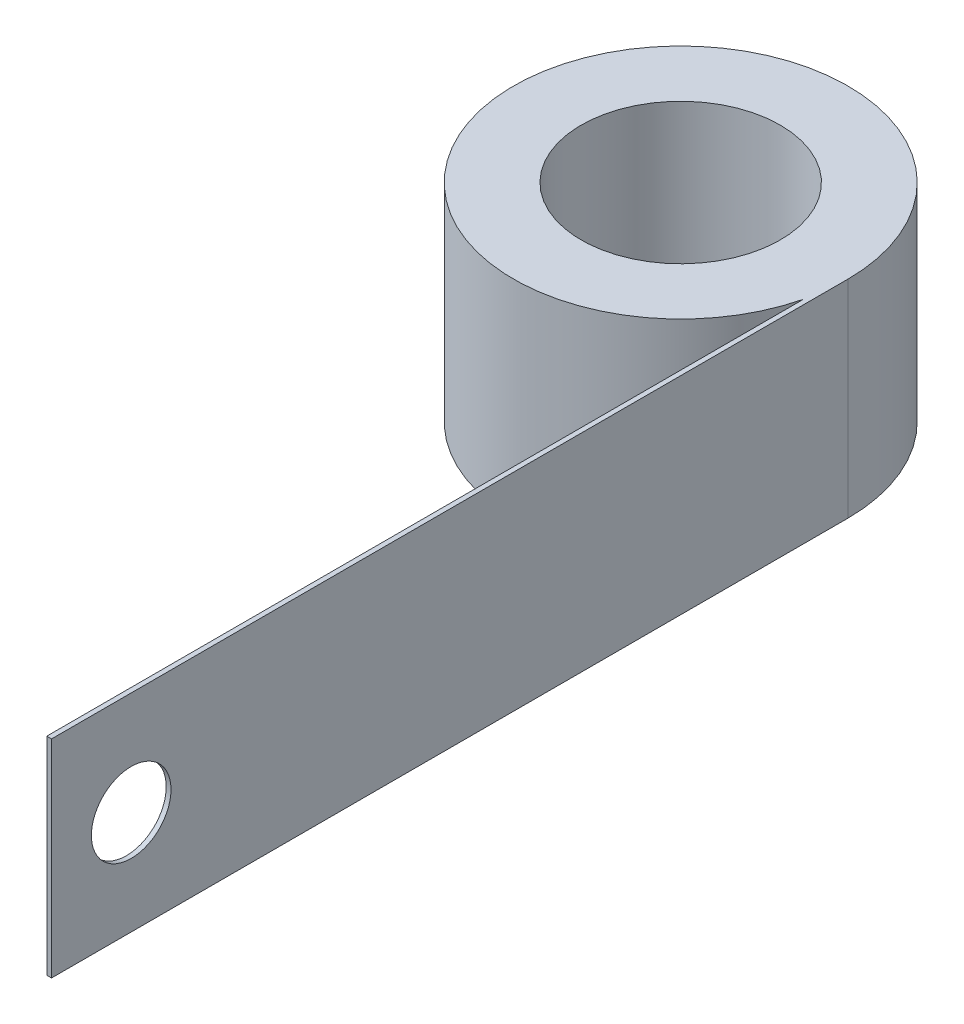
ISO-10303-21;
HEADER;
FILE_DESCRIPTION(('STEP AP214'),'2;1');
FILE_NAME('part.step','',(''),(''),'','','');
FILE_SCHEMA(('AUTOMOTIVE_DESIGN { 1 0 10303 214 1 1 1 1 }'));
ENDSEC;
DATA;
#1=APPLICATION_CONTEXT('core data for automotive mechanical design processes');
#2=APPLICATION_PROTOCOL_DEFINITION('international standard','automotive_design',2000,#1);
#3=PRODUCT_CONTEXT('',#1,'mechanical');
#4=PRODUCT('Part','Part','',(#3));
#5=PRODUCT_RELATED_PRODUCT_CATEGORY('part','',(#4));
#6=PRODUCT_DEFINITION_FORMATION('','',#4);
#7=PRODUCT_DEFINITION_CONTEXT('part definition',#1,'design');
#8=PRODUCT_DEFINITION('design','',#6,#7);
#9=PRODUCT_DEFINITION_SHAPE('','',#8);
#10=(LENGTH_UNIT() NAMED_UNIT(*) SI_UNIT(.MILLI.,.METRE.));
#11=(NAMED_UNIT(*) PLANE_ANGLE_UNIT() SI_UNIT($,.RADIAN.));
#12=(NAMED_UNIT(*) SI_UNIT($,.STERADIAN.) SOLID_ANGLE_UNIT());
#13=UNCERTAINTY_MEASURE_WITH_UNIT(LENGTH_MEASURE(1.E-05),#10,'distance_accuracy_value','');
#14=(GEOMETRIC_REPRESENTATION_CONTEXT(3) GLOBAL_UNCERTAINTY_ASSIGNED_CONTEXT((#13)) GLOBAL_UNIT_ASSIGNED_CONTEXT((#10,
#11,#12)) REPRESENTATION_CONTEXT('',''));
#15=CARTESIAN_POINT('',(0.,0.,0.));
#16=DIRECTION('',(0.,0.,1.));
#17=DIRECTION('',(1.,0.,0.));
#18=AXIS2_PLACEMENT_3D('',#15,#16,#17);
#19=CARTESIAN_POINT('',(0.,13.,0.));
#20=DIRECTION('',(0.,1.,0.));
#21=DIRECTION('',(0.,0.,1.));
#22=AXIS2_PLACEMENT_3D('',#19,#20,#21);
#23=PLANE('',#22);
#24=CARTESIAN_POINT('',(0.,13.,0.));
#25=DIRECTION('',(0.,1.,0.));
#26=DIRECTION('',(0.,0.,1.));
#27=AXIS2_PLACEMENT_3D('',#24,#25,#26);
#28=CIRCLE('',#27,10.5);
#29=CARTESIAN_POINT('',(10.5,13.,0.));
#30=VERTEX_POINT('',#29);
#31=CARTESIAN_POINT('',(10.2,13.,2.49198715887542));
#32=VERTEX_POINT('',#31);
#33=EDGE_CURVE('E42',#30,#32,#28,.T.);
#34=ORIENTED_EDGE('',*,*,#33,.T.);
#35=DIRECTION('',(0.,0.,1.));
#36=VECTOR('',#35,1.);
#37=CARTESIAN_POINT('',(10.2,13.,0.));
#38=LINE('',#37,#36);
#39=CARTESIAN_POINT('',(10.2,13.,50.));
#40=VERTEX_POINT('',#39);
#41=EDGE_CURVE('E72',#32,#40,#38,.T.);
#42=ORIENTED_EDGE('',*,*,#41,.T.);
#43=DIRECTION('',(1.,0.,0.));
#44=VECTOR('',#43,1.);
#45=CARTESIAN_POINT('',(10.5,13.,50.));
#46=LINE('',#45,#44);
#47=CARTESIAN_POINT('',(10.5,13.,50.));
#48=VERTEX_POINT('',#47);
#49=EDGE_CURVE('E77',#40,#48,#46,.T.);
#50=ORIENTED_EDGE('',*,*,#49,.T.);
#51=DIRECTION('',(0.,0.,-1.));
#52=VECTOR('',#51,1.);
#53=CARTESIAN_POINT('',(10.5,13.,0.));
#54=LINE('',#53,#52);
#55=EDGE_CURVE('E79',#48,#30,#54,.T.);
#56=ORIENTED_EDGE('',*,*,#55,.T.);
#57=EDGE_LOOP('',(#34,#42,#50,#56));
#58=FACE_BOUND('',#57,.T.);
#59=CARTESIAN_POINT('',(0.,13.,0.));
#60=DIRECTION('',(0.,1.,0.));
#61=DIRECTION('',(0.,0.,1.));
#62=AXIS2_PLACEMENT_3D('',#59,#60,#61);
#63=CIRCLE('',#62,6.25);
#64=CARTESIAN_POINT('',(0.,13.,-6.25));
#65=VERTEX_POINT('',#64);
#66=EDGE_CURVE('E100',#65,#65,#63,.T.);
#67=ORIENTED_EDGE('',*,*,#66,.F.);
#68=EDGE_LOOP('',(#67));
#69=FACE_BOUND('',#68,.T.);
#70=ADVANCED_FACE('F34',(#58,#69),#23,.T.);
#71=CARTESIAN_POINT('',(0.,0.,0.));
#72=DIRECTION('',(0.,1.,0.));
#73=DIRECTION('',(0.,0.,1.));
#74=AXIS2_PLACEMENT_3D('',#71,#72,#73);
#75=PLANE('',#74);
#76=DIRECTION('',(0.,0.,-1.));
#77=VECTOR('',#76,1.);
#78=CARTESIAN_POINT('',(10.2,0.,0.));
#79=LINE('',#78,#77);
#80=CARTESIAN_POINT('',(10.2,0.,50.));
#81=VERTEX_POINT('',#80);
#82=CARTESIAN_POINT('',(10.2,0.,2.49198715887542));
#83=VERTEX_POINT('',#82);
#84=EDGE_CURVE('E86',#81,#83,#79,.T.);
#85=ORIENTED_EDGE('',*,*,#84,.T.);
#86=CARTESIAN_POINT('',(0.,0.,0.));
#87=DIRECTION('',(0.,1.,0.));
#88=DIRECTION('',(0.,0.,1.));
#89=AXIS2_PLACEMENT_3D('',#86,#87,#88);
#90=CIRCLE('',#89,10.5);
#91=CARTESIAN_POINT('',(10.5,0.,0.));
#92=VERTEX_POINT('',#91);
#93=EDGE_CURVE('E48',#92,#83,#90,.T.);
#94=ORIENTED_EDGE('',*,*,#93,.F.);
#95=DIRECTION('',(0.,0.,1.));
#96=VECTOR('',#95,1.);
#97=CARTESIAN_POINT('',(10.5,0.,0.));
#98=LINE('',#97,#96);
#99=CARTESIAN_POINT('',(10.5,0.,50.));
#100=VERTEX_POINT('',#99);
#101=EDGE_CURVE('E106',#92,#100,#98,.T.);
#102=ORIENTED_EDGE('',*,*,#101,.T.);
#103=DIRECTION('',(-1.,0.,0.));
#104=VECTOR('',#103,1.);
#105=CARTESIAN_POINT('',(10.5,0.,50.));
#106=LINE('',#105,#104);
#107=EDGE_CURVE('E109',#100,#81,#106,.T.);
#108=ORIENTED_EDGE('',*,*,#107,.T.);
#109=EDGE_LOOP('',(#85,#94,#102,#108));
#110=FACE_BOUND('',#109,.T.);
#111=CARTESIAN_POINT('',(0.,0.,0.));
#112=DIRECTION('',(0.,1.,0.));
#113=DIRECTION('',(0.,0.,1.));
#114=AXIS2_PLACEMENT_3D('',#111,#112,#113);
#115=CIRCLE('',#114,6.25);
#116=CARTESIAN_POINT('',(0.,0.,-6.25));
#117=VERTEX_POINT('',#116);
#118=EDGE_CURVE('E103',#117,#117,#115,.T.);
#119=ORIENTED_EDGE('',*,*,#118,.T.);
#120=EDGE_LOOP('',(#119));
#121=FACE_BOUND('',#120,.T.);
#122=ADVANCED_FACE('F123',(#110,#121),#75,.F.);
#123=CARTESIAN_POINT('',(0.,13.,0.));
#124=DIRECTION('',(0.,-1.,0.));
#125=DIRECTION('',(0.,0.,-1.));
#126=AXIS2_PLACEMENT_3D('',#123,#124,#125);
#127=CYLINDRICAL_SURFACE('',#126,10.5);
#128=ORIENTED_EDGE('',*,*,#93,.T.);
#129=DIRECTION('',(0.,-1.,0.));
#130=VECTOR('',#129,1.);
#131=CARTESIAN_POINT('',(10.2,13.,2.49198715887542));
#132=LINE('',#131,#130);
#133=EDGE_CURVE('E11',#83,#32,#132,.F.);
#134=ORIENTED_EDGE('',*,*,#133,.T.);
#135=ORIENTED_EDGE('',*,*,#33,.F.);
#136=DIRECTION('',(0.,1.,0.));
#137=VECTOR('',#136,1.);
#138=CARTESIAN_POINT('',(10.5,-50.0008999919001,0.));
#139=LINE('',#138,#137);
#140=EDGE_CURVE('E90',#92,#30,#139,.T.);
#141=ORIENTED_EDGE('',*,*,#140,.F.);
#142=EDGE_LOOP('',(#128,#134,#135,#141));
#143=FACE_BOUND('',#142,.T.);
#144=ADVANCED_FACE('F36',(#143),#127,.T.);
#145=CARTESIAN_POINT('',(0.,13.,0.));
#146=DIRECTION('',(0.,-1.,0.));
#147=DIRECTION('',(0.,0.,-1.));
#148=AXIS2_PLACEMENT_3D('',#145,#146,#147);
#149=CYLINDRICAL_SURFACE('',#148,6.25);
#150=CARTESIAN_POINT('',(0.,13.,-6.25));
#151=CARTESIAN_POINT('',(0.,12.8645833333333,-6.25));
#152=CARTESIAN_POINT('',(0.,12.7291666666667,-6.25));
#153=CARTESIAN_POINT('',(0.,12.4583333333333,-6.25));
#154=CARTESIAN_POINT('',(0.,12.3229166666667,-6.25));
#155=CARTESIAN_POINT('',(0.,12.0520833333333,-6.25));
#156=CARTESIAN_POINT('',(0.,11.9166666666667,-6.25));
#157=CARTESIAN_POINT('',(0.,11.6458333333333,-6.25));
#158=CARTESIAN_POINT('',(0.,11.5104166666667,-6.25));
#159=CARTESIAN_POINT('',(0.,11.2395833333333,-6.25));
#160=CARTESIAN_POINT('',(0.,11.1041666666667,-6.25));
#161=CARTESIAN_POINT('',(0.,10.8333333333333,-6.25));
#162=CARTESIAN_POINT('',(0.,10.6979166666667,-6.25));
#163=CARTESIAN_POINT('',(0.,10.4270833333333,-6.25));
#164=CARTESIAN_POINT('',(0.,10.2916666666667,-6.25));
#165=CARTESIAN_POINT('',(0.,10.0208333333333,-6.25));
#166=CARTESIAN_POINT('',(0.,9.88541666666667,-6.25));
#167=CARTESIAN_POINT('',(0.,9.61458333333333,-6.25));
#168=CARTESIAN_POINT('',(0.,9.47916666666667,-6.25));
#169=CARTESIAN_POINT('',(0.,9.20833333333333,-6.25));
#170=CARTESIAN_POINT('',(0.,9.07291666666667,-6.25));
#171=CARTESIAN_POINT('',(0.,8.80208333333333,-6.25));
#172=CARTESIAN_POINT('',(0.,8.66666666666667,-6.25));
#173=CARTESIAN_POINT('',(0.,8.39583333333333,-6.25));
#174=CARTESIAN_POINT('',(0.,8.26041666666667,-6.25));
#175=CARTESIAN_POINT('',(0.,7.98958333333333,-6.25));
#176=CARTESIAN_POINT('',(0.,7.85416666666667,-6.25));
#177=CARTESIAN_POINT('',(0.,7.58333333333333,-6.25));
#178=CARTESIAN_POINT('',(0.,7.44791666666667,-6.25));
#179=CARTESIAN_POINT('',(0.,7.17708333333333,-6.25));
#180=CARTESIAN_POINT('',(0.,7.04166666666667,-6.25));
#181=CARTESIAN_POINT('',(0.,6.77083333333333,-6.25));
#182=CARTESIAN_POINT('',(0.,6.63541666666667,-6.25));
#183=CARTESIAN_POINT('',(0.,6.36458333333333,-6.25));
#184=CARTESIAN_POINT('',(0.,6.22916666666667,-6.25));
#185=CARTESIAN_POINT('',(0.,5.95833333333333,-6.25));
#186=CARTESIAN_POINT('',(0.,5.82291666666667,-6.25));
#187=CARTESIAN_POINT('',(0.,5.55208333333333,-6.25));
#188=CARTESIAN_POINT('',(0.,5.41666666666667,-6.25));
#189=CARTESIAN_POINT('',(0.,5.14583333333333,-6.25));
#190=CARTESIAN_POINT('',(0.,5.01041666666667,-6.25));
#191=CARTESIAN_POINT('',(0.,4.73958333333333,-6.25));
#192=CARTESIAN_POINT('',(0.,4.60416666666667,-6.25));
#193=CARTESIAN_POINT('',(0.,4.33333333333333,-6.25));
#194=CARTESIAN_POINT('',(0.,4.19791666666667,-6.25));
#195=CARTESIAN_POINT('',(0.,3.92708333333333,-6.25));
#196=CARTESIAN_POINT('',(0.,3.79166666666667,-6.25));
#197=CARTESIAN_POINT('',(0.,3.52083333333333,-6.25));
#198=CARTESIAN_POINT('',(0.,3.38541666666667,-6.25));
#199=CARTESIAN_POINT('',(0.,3.11458333333333,-6.25));
#200=CARTESIAN_POINT('',(0.,2.97916666666667,-6.25));
#201=CARTESIAN_POINT('',(0.,2.70833333333333,-6.25));
#202=CARTESIAN_POINT('',(0.,2.57291666666667,-6.25));
#203=CARTESIAN_POINT('',(0.,2.30208333333333,-6.25));
#204=CARTESIAN_POINT('',(0.,2.16666666666667,-6.25));
#205=CARTESIAN_POINT('',(0.,1.89583333333333,-6.25));
#206=CARTESIAN_POINT('',(0.,1.76041666666667,-6.25));
#207=CARTESIAN_POINT('',(0.,1.48958333333333,-6.25));
#208=CARTESIAN_POINT('',(0.,1.35416666666667,-6.25));
#209=CARTESIAN_POINT('',(0.,1.08333333333333,-6.25));
#210=CARTESIAN_POINT('',(0.,0.947916666666667,-6.25));
#211=CARTESIAN_POINT('',(0.,0.677083333333334,-6.25));
#212=CARTESIAN_POINT('',(0.,0.541666666666667,-6.25));
#213=CARTESIAN_POINT('',(0.,0.270833333333334,-6.25));
#214=CARTESIAN_POINT('',(0.,0.135416666666667,-6.25));
#215=CARTESIAN_POINT('',(0.,0.,-6.25));
#216=B_SPLINE_CURVE_WITH_KNOTS('',3,(#150,#151,#152,#153,#154,#155,#156,#157,#158,#159,#160,
#161,#162,#163,#164,#165,#166,#167,#168,#169,#170,#171,#172,#173,#174,#175,#176,#177,#178,#179,
#180,#181,#182,#183,#184,#185,#186,#187,#188,#189,#190,#191,#192,#193,#194,#195,#196,#197,#198,
#199,#200,#201,#202,#203,#204,#205,#206,#207,#208,#209,#210,#211,#212,#213,#214,#215),
.UNSPECIFIED.,.F.,.F.,(4,2,2,2,2,2,2,2,2,2,2,2,2,2,2,2,2,2,2,2,2,2,2,2,2,2,2,2,2,2,2,2,4),(0.,
0.406249999999999,0.812499999999999,1.21875,1.625,2.03125,2.4375,2.84375,3.25,3.65625,4.0625,
4.46875,4.875,5.28125,5.6875,6.09375,6.5,6.90625,7.3125,7.71875,8.125,8.53125,8.9375,9.34375,
9.75,10.15625,10.5625,10.96875,11.375,11.78125,12.1875,12.59375,13.),.UNSPECIFIED.);
#217=EDGE_CURVE('BSEAM127',#65,#117,#216,.T.);
#218=ORIENTED_EDGE('',*,*,#66,.T.);
#219=ORIENTED_EDGE('',*,*,#118,.F.);
#220=ORIENTED_EDGE('',*,*,#217,.T.);
#221=ORIENTED_EDGE('',*,*,#217,.F.);
#222=EDGE_LOOP('',(#218,#220,#219,#221));
#223=FACE_BOUND('',#222,.T.);
#224=ADVANCED_FACE('F127',(#223),#149,.F.);
#225=CARTESIAN_POINT('',(10.2,-50.0008999919001,0.));
#226=DIRECTION('',(-1.,0.,0.));
#227=DIRECTION('',(0.,0.,1.));
#228=AXIS2_PLACEMENT_3D('',#225,#226,#227);
#229=PLANE('',#228);
#230=CARTESIAN_POINT('',(10.2,6.5,45.));
#231=DIRECTION('',(-1.,0.,0.));
#232=DIRECTION('',(0.,0.,1.));
#233=AXIS2_PLACEMENT_3D('',#230,#231,#232);
#234=CIRCLE('',#233,2.50000000000001);
#235=CARTESIAN_POINT('',(10.2,6.5,47.5));
#236=VERTEX_POINT('',#235);
#237=EDGE_CURVE('E115',#236,#236,#234,.T.);
#238=ORIENTED_EDGE('',*,*,#237,.F.);
#239=EDGE_LOOP('',(#238));
#240=FACE_BOUND('',#239,.T.);
#241=ORIENTED_EDGE('',*,*,#133,.F.);
#242=ORIENTED_EDGE('',*,*,#84,.F.);
#243=DIRECTION('',(0.,1.,0.));
#244=VECTOR('',#243,1.);
#245=CARTESIAN_POINT('',(10.2,-50.0008999919001,50.));
#246=LINE('',#245,#244);
#247=EDGE_CURVE('E83',#81,#40,#246,.T.);
#248=ORIENTED_EDGE('',*,*,#247,.T.);
#249=ORIENTED_EDGE('',*,*,#41,.F.);
#250=EDGE_LOOP('',(#241,#242,#248,#249));
#251=FACE_BOUND('',#250,.T.);
#252=ADVANCED_FACE('F84',(#240,#251),#229,.T.);
#253=CARTESIAN_POINT('',(10.5,-50.0008999919001,0.));
#254=DIRECTION('',(1.,0.,0.));
#255=DIRECTION('',(0.,0.,-1.));
#256=AXIS2_PLACEMENT_3D('',#253,#254,#255);
#257=PLANE('',#256);
#258=CARTESIAN_POINT('',(10.5,6.5,45.));
#259=DIRECTION('',(1.,0.,0.));
#260=DIRECTION('',(0.,0.,-1.));
#261=AXIS2_PLACEMENT_3D('',#258,#259,#260);
#262=CIRCLE('',#261,2.50000000000001);
#263=CARTESIAN_POINT('',(10.5,6.5,42.5));
#264=VERTEX_POINT('',#263);
#265=EDGE_CURVE('E117',#264,#264,#262,.T.);
#266=ORIENTED_EDGE('',*,*,#265,.F.);
#267=EDGE_LOOP('',(#266));
#268=FACE_BOUND('',#267,.T.);
#269=ORIENTED_EDGE('',*,*,#101,.F.);
#270=ORIENTED_EDGE('',*,*,#140,.T.);
#271=ORIENTED_EDGE('',*,*,#55,.F.);
#272=DIRECTION('',(0.,1.,0.));
#273=VECTOR('',#272,1.);
#274=CARTESIAN_POINT('',(10.5,-50.0008999919001,50.));
#275=LINE('',#274,#273);
#276=EDGE_CURVE('E89',#100,#48,#275,.T.);
#277=ORIENTED_EDGE('',*,*,#276,.F.);
#278=EDGE_LOOP('',(#269,#270,#271,#277));
#279=FACE_BOUND('',#278,.T.);
#280=ADVANCED_FACE('F125',(#268,#279),#257,.T.);
#281=CARTESIAN_POINT('',(10.5,-50.0008999919001,50.));
#282=DIRECTION('',(0.,0.,1.));
#283=DIRECTION('',(1.,0.,0.));
#284=AXIS2_PLACEMENT_3D('',#281,#282,#283);
#285=PLANE('',#284);
#286=ORIENTED_EDGE('',*,*,#107,.F.);
#287=ORIENTED_EDGE('',*,*,#276,.T.);
#288=ORIENTED_EDGE('',*,*,#49,.F.);
#289=ORIENTED_EDGE('',*,*,#247,.F.);
#290=EDGE_LOOP('',(#286,#287,#288,#289));
#291=FACE_BOUND('',#290,.T.);
#292=ADVANCED_FACE('F92',(#291),#285,.T.);
#293=CARTESIAN_POINT('',(-10.5,6.5,45.));
#294=DIRECTION('',(1.,0.,0.));
#295=DIRECTION('',(0.,0.,-1.));
#296=AXIS2_PLACEMENT_3D('',#293,#294,#295);
#297=CYLINDRICAL_SURFACE('',#296,2.50000000000001);
#298=ORIENTED_EDGE('',*,*,#237,.T.);
#299=EDGE_LOOP('',(#298));
#300=FACE_BOUND('',#299,.T.);
#301=ORIENTED_EDGE('',*,*,#265,.T.);
#302=EDGE_LOOP('',(#301));
#303=FACE_BOUND('',#302,.T.);
#304=ADVANCED_FACE('F147',(#300,#303),#297,.F.);
#305=CLOSED_SHELL('',(#70,#122,#144,#224,#252,#280,#292,#304));
#306=MANIFOLD_SOLID_BREP('B2',#305);
#307=ADVANCED_BREP_SHAPE_REPRESENTATION('',(#18,#306),#14);
#308=SHAPE_DEFINITION_REPRESENTATION(#9,#307);
ENDSEC;
END-ISO-10303-21;
